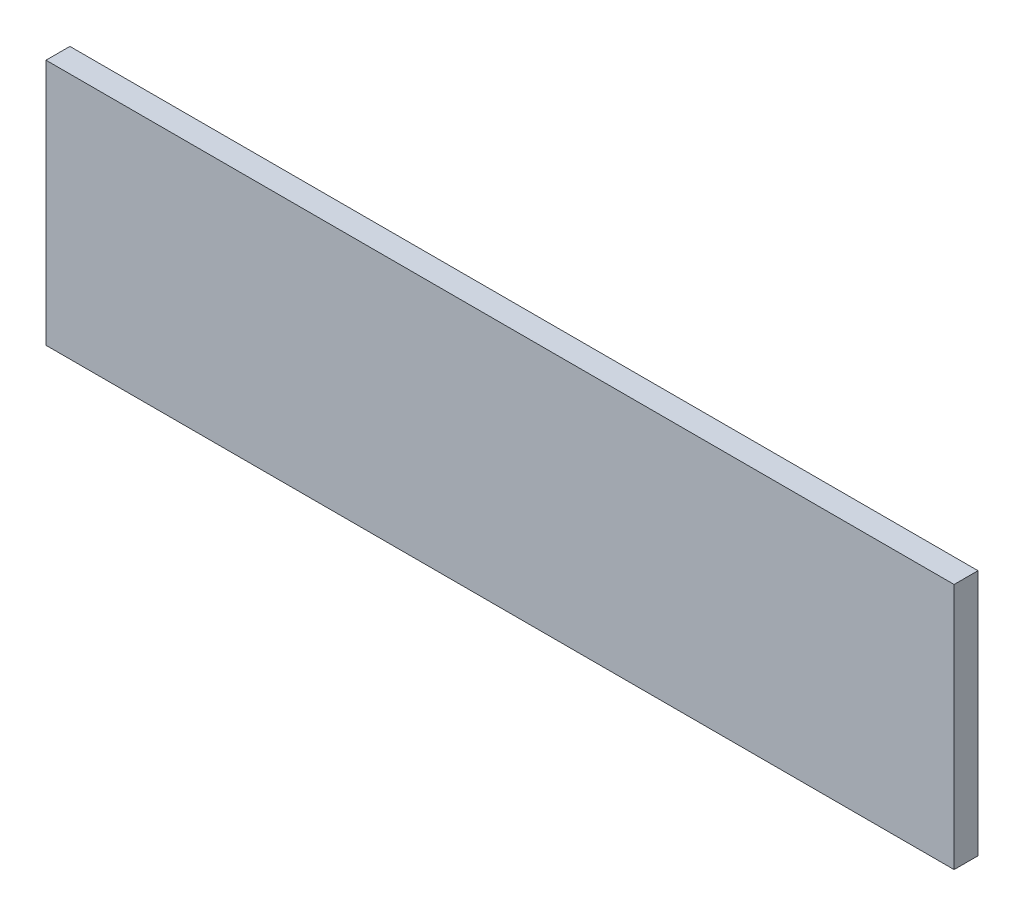
ISO-10303-21;
HEADER;
FILE_DESCRIPTION(('STEP AP214'),'2;1');
FILE_NAME('part.step','',(''),(''),'','','');
FILE_SCHEMA(('AUTOMOTIVE_DESIGN { 1 0 10303 214 1 1 1 1 }'));
ENDSEC;
DATA;
#1=APPLICATION_CONTEXT('core data for automotive mechanical design processes');
#2=APPLICATION_PROTOCOL_DEFINITION('international standard','automotive_design',2000,#1);
#3=PRODUCT_CONTEXT('',#1,'mechanical');
#4=PRODUCT('Part','Part','',(#3));
#5=PRODUCT_RELATED_PRODUCT_CATEGORY('part','',(#4));
#6=PRODUCT_DEFINITION_FORMATION('','',#4);
#7=PRODUCT_DEFINITION_CONTEXT('part definition',#1,'design');
#8=PRODUCT_DEFINITION('design','',#6,#7);
#9=PRODUCT_DEFINITION_SHAPE('','',#8);
#10=(LENGTH_UNIT() NAMED_UNIT(*) SI_UNIT(.MILLI.,.METRE.));
#11=(NAMED_UNIT(*) PLANE_ANGLE_UNIT() SI_UNIT($,.RADIAN.));
#12=(NAMED_UNIT(*) SI_UNIT($,.STERADIAN.) SOLID_ANGLE_UNIT());
#13=UNCERTAINTY_MEASURE_WITH_UNIT(LENGTH_MEASURE(1.E-05),#10,'distance_accuracy_value','');
#14=(GEOMETRIC_REPRESENTATION_CONTEXT(3) GLOBAL_UNCERTAINTY_ASSIGNED_CONTEXT((#13)) GLOBAL_UNIT_ASSIGNED_CONTEXT((#10,
#11,#12)) REPRESENTATION_CONTEXT('',''));
#15=CARTESIAN_POINT('',(0.,0.,0.));
#16=DIRECTION('',(0.,0.,1.));
#17=DIRECTION('',(1.,0.,0.));
#18=AXIS2_PLACEMENT_3D('',#15,#16,#17);
#19=CARTESIAN_POINT('',(57.,31.,-1.5));
#20=DIRECTION('',(-1.,0.,0.));
#21=DIRECTION('',(0.,0.,1.));
#22=AXIS2_PLACEMENT_3D('',#19,#20,#21);
#23=PLANE('',#22);
#24=DIRECTION('',(0.,0.,-1.));
#25=VECTOR('',#24,1.);
#26=CARTESIAN_POINT('',(57.,0.,-1.5));
#27=LINE('',#26,#25);
#28=CARTESIAN_POINT('',(57.,0.,1.5));
#29=VERTEX_POINT('',#28);
#30=CARTESIAN_POINT('',(57.,0.,-1.5));
#31=VERTEX_POINT('',#30);
#32=EDGE_CURVE('E98',#29,#31,#27,.T.);
#33=ORIENTED_EDGE('',*,*,#32,.T.);
#34=DIRECTION('',(0.,-1.,0.));
#35=VECTOR('',#34,1.);
#36=CARTESIAN_POINT('',(57.,31.,-1.5));
#37=LINE('',#36,#35);
#38=CARTESIAN_POINT('',(57.,31.,-1.5));
#39=VERTEX_POINT('',#38);
#40=EDGE_CURVE('E11',#39,#31,#37,.T.);
#41=ORIENTED_EDGE('',*,*,#40,.F.);
#42=DIRECTION('',(0.,0.,-1.));
#43=VECTOR('',#42,1.);
#44=CARTESIAN_POINT('',(57.,31.,-1.5));
#45=LINE('',#44,#43);
#46=CARTESIAN_POINT('',(57.,31.,1.5));
#47=VERTEX_POINT('',#46);
#48=EDGE_CURVE('E86',#47,#39,#45,.T.);
#49=ORIENTED_EDGE('',*,*,#48,.F.);
#50=DIRECTION('',(0.,-1.,0.));
#51=VECTOR('',#50,1.);
#52=CARTESIAN_POINT('',(57.,31.,1.5));
#53=LINE('',#52,#51);
#54=EDGE_CURVE('E94',#47,#29,#53,.T.);
#55=ORIENTED_EDGE('',*,*,#54,.T.);
#56=EDGE_LOOP('',(#33,#41,#49,#55));
#57=FACE_BOUND('',#56,.T.);
#58=ADVANCED_FACE('F35',(#57),#23,.F.);
#59=CARTESIAN_POINT('',(-57.,31.,-1.5));
#60=DIRECTION('',(0.,0.,1.));
#61=DIRECTION('',(1.,0.,0.));
#62=AXIS2_PLACEMENT_3D('',#59,#60,#61);
#63=PLANE('',#62);
#64=DIRECTION('',(-1.,0.,0.));
#65=VECTOR('',#64,1.);
#66=CARTESIAN_POINT('',(-57.,0.,-1.5));
#67=LINE('',#66,#65);
#68=CARTESIAN_POINT('',(-57.,0.,-1.5));
#69=VERTEX_POINT('',#68);
#70=EDGE_CURVE('E90',#31,#69,#67,.T.);
#71=ORIENTED_EDGE('',*,*,#70,.T.);
#72=DIRECTION('',(0.,-1.,0.));
#73=VECTOR('',#72,1.);
#74=CARTESIAN_POINT('',(-57.,31.,-1.5));
#75=LINE('',#74,#73);
#76=CARTESIAN_POINT('',(-57.,31.,-1.5));
#77=VERTEX_POINT('',#76);
#78=EDGE_CURVE('E43',#77,#69,#75,.T.);
#79=ORIENTED_EDGE('',*,*,#78,.F.);
#80=DIRECTION('',(-1.,0.,0.));
#81=VECTOR('',#80,1.);
#82=CARTESIAN_POINT('',(-57.,31.,-1.5));
#83=LINE('',#82,#81);
#84=EDGE_CURVE('E81',#39,#77,#83,.T.);
#85=ORIENTED_EDGE('',*,*,#84,.F.);
#86=ORIENTED_EDGE('',*,*,#40,.T.);
#87=EDGE_LOOP('',(#71,#79,#85,#86));
#88=FACE_BOUND('',#87,.T.);
#89=ADVANCED_FACE('F89',(#88),#63,.F.);
#90=CARTESIAN_POINT('',(-57.,31.,-1.5));
#91=DIRECTION('',(1.,0.,0.));
#92=DIRECTION('',(0.,0.,-1.));
#93=AXIS2_PLACEMENT_3D('',#90,#91,#92);
#94=PLANE('',#93);
#95=DIRECTION('',(0.,0.,1.));
#96=VECTOR('',#95,1.);
#97=CARTESIAN_POINT('',(-57.,0.,-1.5));
#98=LINE('',#97,#96);
#99=CARTESIAN_POINT('',(-57.,0.,1.5));
#100=VERTEX_POINT('',#99);
#101=EDGE_CURVE('E68',#69,#100,#98,.T.);
#102=ORIENTED_EDGE('',*,*,#101,.T.);
#103=DIRECTION('',(0.,-1.,0.));
#104=VECTOR('',#103,1.);
#105=CARTESIAN_POINT('',(-57.,31.,1.5));
#106=LINE('',#105,#104);
#107=CARTESIAN_POINT('',(-57.,31.,1.5));
#108=VERTEX_POINT('',#107);
#109=EDGE_CURVE('E91',#108,#100,#106,.T.);
#110=ORIENTED_EDGE('',*,*,#109,.F.);
#111=DIRECTION('',(0.,0.,1.));
#112=VECTOR('',#111,1.);
#113=CARTESIAN_POINT('',(-57.,31.,-1.5));
#114=LINE('',#113,#112);
#115=EDGE_CURVE('E84',#77,#108,#114,.T.);
#116=ORIENTED_EDGE('',*,*,#115,.F.);
#117=ORIENTED_EDGE('',*,*,#78,.T.);
#118=EDGE_LOOP('',(#102,#110,#116,#117));
#119=FACE_BOUND('',#118,.T.);
#120=ADVANCED_FACE('F92',(#119),#94,.F.);
#121=CARTESIAN_POINT('',(-57.,31.,1.5));
#122=DIRECTION('',(0.,0.,-1.));
#123=DIRECTION('',(-1.,0.,0.));
#124=AXIS2_PLACEMENT_3D('',#121,#122,#123);
#125=PLANE('',#124);
#126=DIRECTION('',(1.,0.,0.));
#127=VECTOR('',#126,1.);
#128=CARTESIAN_POINT('',(-57.,0.,1.5));
#129=LINE('',#128,#127);
#130=EDGE_CURVE('E74',#100,#29,#129,.T.);
#131=ORIENTED_EDGE('',*,*,#130,.T.);
#132=ORIENTED_EDGE('',*,*,#54,.F.);
#133=DIRECTION('',(1.,0.,0.));
#134=VECTOR('',#133,1.);
#135=CARTESIAN_POINT('',(-57.,31.,1.5));
#136=LINE('',#135,#134);
#137=EDGE_CURVE('E51',#108,#47,#136,.T.);
#138=ORIENTED_EDGE('',*,*,#137,.F.);
#139=ORIENTED_EDGE('',*,*,#109,.T.);
#140=EDGE_LOOP('',(#131,#132,#138,#139));
#141=FACE_BOUND('',#140,.T.);
#142=ADVANCED_FACE('F105',(#141),#125,.F.);
#143=CARTESIAN_POINT('',(0.,31.,0.));
#144=DIRECTION('',(0.,1.,0.));
#145=DIRECTION('',(0.,0.,1.));
#146=AXIS2_PLACEMENT_3D('',#143,#144,#145);
#147=PLANE('',#146);
#148=ORIENTED_EDGE('',*,*,#48,.T.);
#149=ORIENTED_EDGE('',*,*,#84,.T.);
#150=ORIENTED_EDGE('',*,*,#115,.T.);
#151=ORIENTED_EDGE('',*,*,#137,.T.);
#152=EDGE_LOOP('',(#148,#149,#150,#151));
#153=FACE_BOUND('',#152,.T.);
#154=ADVANCED_FACE('F82',(#153),#147,.T.);
#155=CARTESIAN_POINT('',(0.,0.,0.));
#156=DIRECTION('',(0.,1.,0.));
#157=DIRECTION('',(0.,0.,1.));
#158=AXIS2_PLACEMENT_3D('',#155,#156,#157);
#159=PLANE('',#158);
#160=ORIENTED_EDGE('',*,*,#32,.F.);
#161=ORIENTED_EDGE('',*,*,#130,.F.);
#162=ORIENTED_EDGE('',*,*,#101,.F.);
#163=ORIENTED_EDGE('',*,*,#70,.F.);
#164=EDGE_LOOP('',(#160,#161,#162,#163));
#165=FACE_BOUND('',#164,.T.);
#166=ADVANCED_FACE('F108',(#165),#159,.F.);
#167=CLOSED_SHELL('',(#58,#89,#120,#142,#154,#166));
#168=MANIFOLD_SOLID_BREP('B2',#167);
#169=ADVANCED_BREP_SHAPE_REPRESENTATION('',(#18,#168),#14);
#170=SHAPE_DEFINITION_REPRESENTATION(#9,#169);
ENDSEC;
END-ISO-10303-21;
